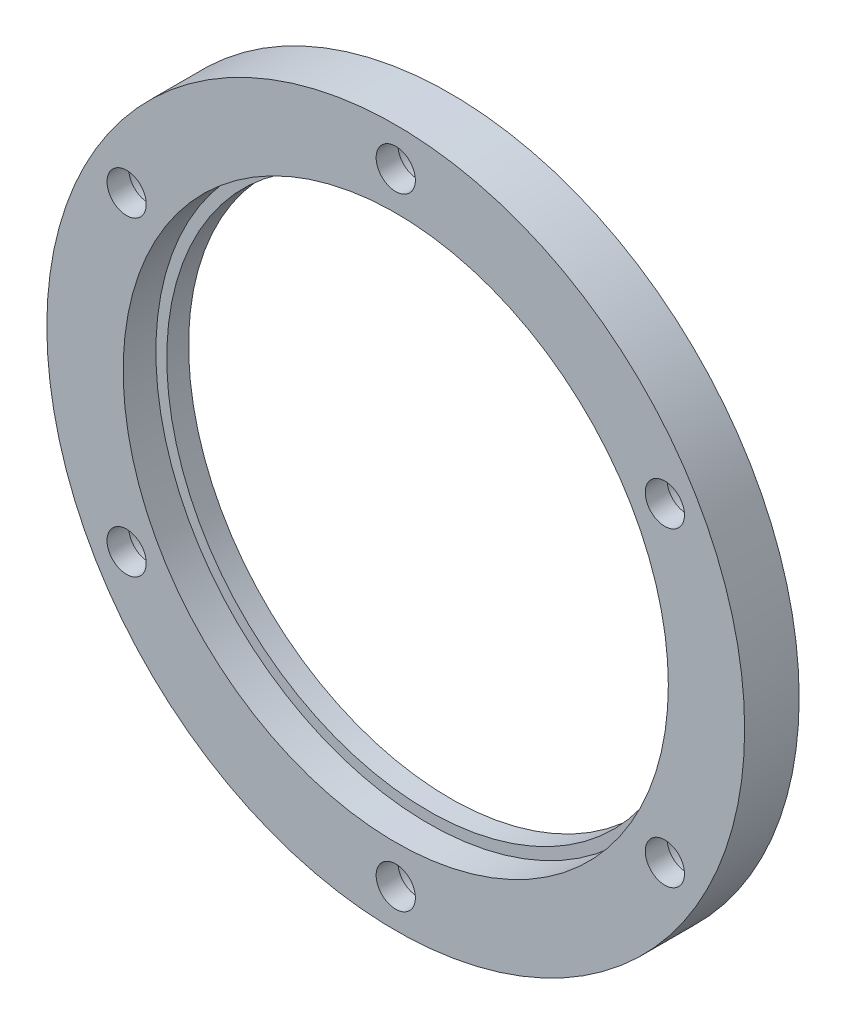
ISO-10303-21;
HEADER;
FILE_DESCRIPTION(('STEP AP214'),'2;1');
FILE_NAME('part.step','',(''),(''),'','','');
FILE_SCHEMA(('AUTOMOTIVE_DESIGN { 1 0 10303 214 1 1 1 1 }'));
ENDSEC;
DATA;
#1=APPLICATION_CONTEXT('core data for automotive mechanical design processes');
#2=APPLICATION_PROTOCOL_DEFINITION('international standard','automotive_design',2000,#1);
#3=PRODUCT_CONTEXT('',#1,'mechanical');
#4=PRODUCT('Part','Part','',(#3));
#5=PRODUCT_RELATED_PRODUCT_CATEGORY('part','',(#4));
#6=PRODUCT_DEFINITION_FORMATION('','',#4);
#7=PRODUCT_DEFINITION_CONTEXT('part definition',#1,'design');
#8=PRODUCT_DEFINITION('design','',#6,#7);
#9=PRODUCT_DEFINITION_SHAPE('','',#8);
#10=(LENGTH_UNIT() NAMED_UNIT(*) SI_UNIT(.MILLI.,.METRE.));
#11=(NAMED_UNIT(*) PLANE_ANGLE_UNIT() SI_UNIT($,.RADIAN.));
#12=(NAMED_UNIT(*) SI_UNIT($,.STERADIAN.) SOLID_ANGLE_UNIT());
#13=UNCERTAINTY_MEASURE_WITH_UNIT(LENGTH_MEASURE(1.E-05),#10,'distance_accuracy_value','');
#14=(GEOMETRIC_REPRESENTATION_CONTEXT(3) GLOBAL_UNCERTAINTY_ASSIGNED_CONTEXT((#13)) GLOBAL_UNIT_ASSIGNED_CONTEXT((#10,
#11,#12)) REPRESENTATION_CONTEXT('',''));
#15=CARTESIAN_POINT('',(0.,0.,0.));
#16=DIRECTION('',(0.,0.,1.));
#17=DIRECTION('',(1.,0.,0.));
#18=AXIS2_PLACEMENT_3D('',#15,#16,#17);
#19=CARTESIAN_POINT('',(24.6817240078565,14.25,0.));
#20=DIRECTION('',(0.,0.,1.));
#21=DIRECTION('',(1.,0.,0.));
#22=AXIS2_PLACEMENT_3D('',#19,#20,#21);
#23=CYLINDRICAL_SURFACE('',#22,1.8);
#24=CARTESIAN_POINT('',(24.6817240078565,14.25,3.));
#25=DIRECTION('',(0.,0.,-1.));
#26=DIRECTION('',(-1.,0.,0.));
#27=AXIS2_PLACEMENT_3D('',#24,#25,#26);
#28=CIRCLE('',#27,1.8);
#29=CARTESIAN_POINT('',(22.8817240078565,14.25,3.));
#30=VERTEX_POINT('',#29);
#31=EDGE_CURVE('E50',#30,#30,#28,.F.);
#32=ORIENTED_EDGE('',*,*,#31,.F.);
#33=EDGE_LOOP('',(#32));
#34=FACE_BOUND('',#33,.T.);
#35=CARTESIAN_POINT('',(24.6817240078566,14.2499999999999,5.));
#36=DIRECTION('',(0.,0.,1.));
#37=DIRECTION('',(1.,0.,0.));
#38=AXIS2_PLACEMENT_3D('',#35,#36,#37);
#39=CIRCLE('',#38,1.8);
#40=CARTESIAN_POINT('',(26.4817240078566,14.2499999999999,5.));
#41=VERTEX_POINT('',#40);
#42=EDGE_CURVE('E158',#41,#41,#39,.T.);
#43=ORIENTED_EDGE('',*,*,#42,.T.);
#44=EDGE_LOOP('',(#43));
#45=FACE_BOUND('',#44,.T.);
#46=ADVANCED_FACE('F43',(#34,#45),#23,.F.);
#47=CARTESIAN_POINT('',(24.6817240078565,-14.25,0.));
#48=DIRECTION('',(0.,0.,1.));
#49=DIRECTION('',(1.,0.,0.));
#50=AXIS2_PLACEMENT_3D('',#47,#48,#49);
#51=CYLINDRICAL_SURFACE('',#50,1.8);
#52=CARTESIAN_POINT('',(24.6817240078565,-14.25,3.));
#53=DIRECTION('',(0.,0.,-1.));
#54=DIRECTION('',(-1.,0.,0.));
#55=AXIS2_PLACEMENT_3D('',#52,#53,#54);
#56=CIRCLE('',#55,1.8);
#57=CARTESIAN_POINT('',(22.8817240078565,-14.25,3.));
#58=VERTEX_POINT('',#57);
#59=EDGE_CURVE('E76',#58,#58,#56,.F.);
#60=ORIENTED_EDGE('',*,*,#59,.F.);
#61=EDGE_LOOP('',(#60));
#62=FACE_BOUND('',#61,.T.);
#63=CARTESIAN_POINT('',(24.6817240078564,-14.2500000000002,5.));
#64=DIRECTION('',(0.,0.,1.));
#65=DIRECTION('',(1.,0.,0.));
#66=AXIS2_PLACEMENT_3D('',#63,#64,#65);
#67=CIRCLE('',#66,1.8);
#68=CARTESIAN_POINT('',(26.4817240078564,-14.2500000000002,5.));
#69=VERTEX_POINT('',#68);
#70=EDGE_CURVE('E161',#69,#69,#67,.T.);
#71=ORIENTED_EDGE('',*,*,#70,.T.);
#72=EDGE_LOOP('',(#71));
#73=FACE_BOUND('',#72,.T.);
#74=ADVANCED_FACE('F212',(#62,#73),#51,.F.);
#75=CARTESIAN_POINT('',(0.,-28.5,0.));
#76=DIRECTION('',(0.,0.,1.));
#77=DIRECTION('',(1.,0.,0.));
#78=AXIS2_PLACEMENT_3D('',#75,#76,#77);
#79=CYLINDRICAL_SURFACE('',#78,1.8);
#80=CARTESIAN_POINT('',(0.,-28.5,3.));
#81=DIRECTION('',(0.,0.,-1.));
#82=DIRECTION('',(-1.,0.,0.));
#83=AXIS2_PLACEMENT_3D('',#80,#81,#82);
#84=CIRCLE('',#83,1.8);
#85=CARTESIAN_POINT('',(-1.8,-28.5,3.));
#86=VERTEX_POINT('',#85);
#87=EDGE_CURVE('E74',#86,#86,#84,.F.);
#88=ORIENTED_EDGE('',*,*,#87,.F.);
#89=EDGE_LOOP('',(#88));
#90=FACE_BOUND('',#89,.T.);
#91=CARTESIAN_POINT('',(-2.70616862252382E-13,-28.5,5.));
#92=DIRECTION('',(0.,0.,1.));
#93=DIRECTION('',(1.,0.,0.));
#94=AXIS2_PLACEMENT_3D('',#91,#92,#93);
#95=CIRCLE('',#94,1.8);
#96=CARTESIAN_POINT('',(1.79999999999973,-28.5,5.));
#97=VERTEX_POINT('',#96);
#98=EDGE_CURVE('E170',#97,#97,#95,.T.);
#99=ORIENTED_EDGE('',*,*,#98,.T.);
#100=EDGE_LOOP('',(#99));
#101=FACE_BOUND('',#100,.T.);
#102=ADVANCED_FACE('F219',(#90,#101),#79,.F.);
#103=CARTESIAN_POINT('',(-24.6817240078565,-14.25,0.));
#104=DIRECTION('',(0.,0.,1.));
#105=DIRECTION('',(1.,0.,0.));
#106=AXIS2_PLACEMENT_3D('',#103,#104,#105);
#107=CYLINDRICAL_SURFACE('',#106,1.8);
#108=CARTESIAN_POINT('',(-24.6817240078565,-14.25,3.));
#109=DIRECTION('',(0.,0.,-1.));
#110=DIRECTION('',(-1.,0.,0.));
#111=AXIS2_PLACEMENT_3D('',#108,#109,#110);
#112=CIRCLE('',#111,1.8);
#113=CARTESIAN_POINT('',(-26.4817240078565,-14.25,3.));
#114=VERTEX_POINT('',#113);
#115=EDGE_CURVE('E71',#114,#114,#112,.F.);
#116=ORIENTED_EDGE('',*,*,#115,.F.);
#117=EDGE_LOOP('',(#116));
#118=FACE_BOUND('',#117,.T.);
#119=CARTESIAN_POINT('',(-24.6817240078567,-14.2499999999997,5.));
#120=DIRECTION('',(0.,0.,1.));
#121=DIRECTION('',(1.,0.,0.));
#122=AXIS2_PLACEMENT_3D('',#119,#120,#121);
#123=CIRCLE('',#122,1.8);
#124=CARTESIAN_POINT('',(-22.8817240078567,-14.2499999999997,5.));
#125=VERTEX_POINT('',#124);
#126=EDGE_CURVE('E171',#125,#125,#123,.T.);
#127=ORIENTED_EDGE('',*,*,#126,.T.);
#128=EDGE_LOOP('',(#127));
#129=FACE_BOUND('',#128,.T.);
#130=ADVANCED_FACE('F176',(#118,#129),#107,.F.);
#131=CARTESIAN_POINT('',(-24.6817240078565,14.25,0.));
#132=DIRECTION('',(0.,0.,1.));
#133=DIRECTION('',(1.,0.,0.));
#134=AXIS2_PLACEMENT_3D('',#131,#132,#133);
#135=CYLINDRICAL_SURFACE('',#134,1.8);
#136=CARTESIAN_POINT('',(-24.6817240078565,14.25,3.));
#137=DIRECTION('',(0.,0.,-1.));
#138=DIRECTION('',(-1.,0.,0.));
#139=AXIS2_PLACEMENT_3D('',#136,#137,#138);
#140=CIRCLE('',#139,1.8);
#141=CARTESIAN_POINT('',(-26.4817240078565,14.25,3.));
#142=VERTEX_POINT('',#141);
#143=EDGE_CURVE('E66',#142,#142,#140,.F.);
#144=ORIENTED_EDGE('',*,*,#143,.F.);
#145=EDGE_LOOP('',(#144));
#146=FACE_BOUND('',#145,.T.);
#147=CARTESIAN_POINT('',(-24.6817240078565,14.25,5.));
#148=DIRECTION('',(0.,0.,1.));
#149=DIRECTION('',(1.,0.,0.));
#150=AXIS2_PLACEMENT_3D('',#147,#148,#149);
#151=CIRCLE('',#150,1.8);
#152=CARTESIAN_POINT('',(-22.8817240078565,14.25,5.));
#153=VERTEX_POINT('',#152);
#154=EDGE_CURVE('E151',#153,#153,#151,.T.);
#155=ORIENTED_EDGE('',*,*,#154,.T.);
#156=EDGE_LOOP('',(#155));
#157=FACE_BOUND('',#156,.T.);
#158=ADVANCED_FACE('F210',(#146,#157),#135,.F.);
#159=CARTESIAN_POINT('',(0.,28.5,0.));
#160=DIRECTION('',(0.,0.,1.));
#161=DIRECTION('',(1.,0.,0.));
#162=AXIS2_PLACEMENT_3D('',#159,#160,#161);
#163=CYLINDRICAL_SURFACE('',#162,1.8);
#164=CARTESIAN_POINT('',(0.,28.5,3.));
#165=DIRECTION('',(0.,0.,-1.));
#166=DIRECTION('',(-1.,0.,0.));
#167=AXIS2_PLACEMENT_3D('',#164,#165,#166);
#168=CIRCLE('',#167,1.8);
#169=CARTESIAN_POINT('',(-1.8,28.5,3.));
#170=VERTEX_POINT('',#169);
#171=EDGE_CURVE('E65',#170,#170,#168,.F.);
#172=ORIENTED_EDGE('',*,*,#171,.F.);
#173=EDGE_LOOP('',(#172));
#174=FACE_BOUND('',#173,.T.);
#175=CARTESIAN_POINT('',(0.,28.5,5.));
#176=DIRECTION('',(0.,0.,1.));
#177=DIRECTION('',(1.,0.,0.));
#178=AXIS2_PLACEMENT_3D('',#175,#176,#177);
#179=CIRCLE('',#178,1.8);
#180=CARTESIAN_POINT('',(1.80000000000007,28.5,5.));
#181=VERTEX_POINT('',#180);
#182=EDGE_CURVE('E155',#181,#181,#179,.T.);
#183=ORIENTED_EDGE('',*,*,#182,.T.);
#184=EDGE_LOOP('',(#183));
#185=FACE_BOUND('',#184,.T.);
#186=ADVANCED_FACE('F198',(#174,#185),#163,.F.);
#187=CARTESIAN_POINT('',(0.,0.,2.));
#188=DIRECTION('',(0.,0.,-1.));
#189=DIRECTION('',(-1.,0.,0.));
#190=AXIS2_PLACEMENT_3D('',#187,#188,#189);
#191=CYLINDRICAL_SURFACE('',#190,32.);
#192=CARTESIAN_POINT('',(0.,0.,0.));
#193=DIRECTION('',(0.,0.,1.));
#194=DIRECTION('',(1.,0.,0.));
#195=AXIS2_PLACEMENT_3D('',#192,#193,#194);
#196=CIRCLE('',#195,32.);
#197=CARTESIAN_POINT('',(32.,0.,0.));
#198=VERTEX_POINT('',#197);
#199=EDGE_CURVE('E10',#198,#198,#196,.T.);
#200=ORIENTED_EDGE('',*,*,#199,.T.);
#201=EDGE_LOOP('',(#200));
#202=FACE_BOUND('',#201,.T.);
#203=CARTESIAN_POINT('',(0.,0.,5.));
#204=DIRECTION('',(0.,0.,1.));
#205=DIRECTION('',(1.,0.,0.));
#206=AXIS2_PLACEMENT_3D('',#203,#204,#205);
#207=CIRCLE('',#206,32.);
#208=CARTESIAN_POINT('',(32.,0.,5.));
#209=VERTEX_POINT('',#208);
#210=EDGE_CURVE('E107',#209,#209,#207,.T.);
#211=ORIENTED_EDGE('',*,*,#210,.F.);
#212=EDGE_LOOP('',(#211));
#213=FACE_BOUND('',#212,.T.);
#214=ADVANCED_FACE('F44',(#202,#213),#191,.T.);
#215=CARTESIAN_POINT('',(0.,0.,6.));
#216=DIRECTION('',(0.,0.,-1.));
#217=DIRECTION('',(-1.,0.,0.));
#218=AXIS2_PLACEMENT_3D('',#215,#216,#217);
#219=CYLINDRICAL_SURFACE('',#218,25.);
#220=CARTESIAN_POINT('',(0.,0.,2.));
#221=DIRECTION('',(0.,0.,1.));
#222=DIRECTION('',(1.,0.,0.));
#223=AXIS2_PLACEMENT_3D('',#220,#221,#222);
#224=CIRCLE('',#223,25.);
#225=CARTESIAN_POINT('',(25.,0.,2.));
#226=VERTEX_POINT('',#225);
#227=EDGE_CURVE('E83',#226,#226,#224,.T.);
#228=ORIENTED_EDGE('',*,*,#227,.F.);
#229=EDGE_LOOP('',(#228));
#230=FACE_BOUND('',#229,.T.);
#231=CARTESIAN_POINT('',(0.,0.,5.));
#232=DIRECTION('',(0.,0.,1.));
#233=DIRECTION('',(1.,0.,0.));
#234=AXIS2_PLACEMENT_3D('',#231,#232,#233);
#235=CIRCLE('',#234,25.);
#236=CARTESIAN_POINT('',(25.,0.,5.));
#237=VERTEX_POINT('',#236);
#238=EDGE_CURVE('E150',#237,#237,#235,.T.);
#239=ORIENTED_EDGE('',*,*,#238,.T.);
#240=EDGE_LOOP('',(#239));
#241=FACE_BOUND('',#240,.T.);
#242=ADVANCED_FACE('F199',(#230,#241),#219,.F.);
#243=CARTESIAN_POINT('',(0.,0.,2.));
#244=DIRECTION('',(0.,0.,1.));
#245=DIRECTION('',(1.,0.,0.));
#246=AXIS2_PLACEMENT_3D('',#243,#244,#245);
#247=PLANE('',#246);
#248=CARTESIAN_POINT('',(0.,0.,2.));
#249=DIRECTION('',(0.,0.,1.));
#250=DIRECTION('',(1.,0.,0.));
#251=AXIS2_PLACEMENT_3D('',#248,#249,#250);
#252=CIRCLE('',#251,24.);
#253=CARTESIAN_POINT('',(24.,0.,2.));
#254=VERTEX_POINT('',#253);
#255=EDGE_CURVE('E55',#254,#254,#252,.T.);
#256=ORIENTED_EDGE('',*,*,#255,.F.);
#257=EDGE_LOOP('',(#256));
#258=FACE_BOUND('',#257,.T.);
#259=ORIENTED_EDGE('',*,*,#227,.T.);
#260=EDGE_LOOP('',(#259));
#261=FACE_BOUND('',#260,.T.);
#262=ADVANCED_FACE('F203',(#258,#261),#247,.T.);
#263=CARTESIAN_POINT('',(0.,0.,0.));
#264=DIRECTION('',(0.,0.,1.));
#265=DIRECTION('',(1.,0.,0.));
#266=AXIS2_PLACEMENT_3D('',#263,#264,#265);
#267=PLANE('',#266);
#268=CARTESIAN_POINT('',(-9.65461323865484E-12,-28.5000000000048,0.));
#269=DIRECTION('',(0.,0.,-1.));
#270=DIRECTION('',(-1.,0.,0.));
#271=AXIS2_PLACEMENT_3D('',#268,#269,#270);
#272=CIRCLE('',#271,2.84999999999692);
#273=CARTESIAN_POINT('',(-2.85000000000658,-28.5000000000048,0.));
#274=VERTEX_POINT('',#273);
#275=EDGE_CURVE('E108',#274,#274,#272,.T.);
#276=ORIENTED_EDGE('',*,*,#275,.F.);
#277=EDGE_LOOP('',(#276));
#278=FACE_BOUND('',#277,.T.);
#279=CARTESIAN_POINT('',(-24.6817240078735,-14.2500000000043,0.));
#280=DIRECTION('',(0.,0.,-1.));
#281=DIRECTION('',(-1.,0.,0.));
#282=AXIS2_PLACEMENT_3D('',#279,#280,#281);
#283=CIRCLE('',#282,2.85000000000252);
#284=CARTESIAN_POINT('',(-27.531724007876,-14.2500000000043,0.));
#285=VERTEX_POINT('',#284);
#286=EDGE_CURVE('E120',#285,#285,#283,.T.);
#287=ORIENTED_EDGE('',*,*,#286,.F.);
#288=EDGE_LOOP('',(#287));
#289=FACE_BOUND('',#288,.T.);
#290=CARTESIAN_POINT('',(-24.6817240078767,14.2500000000023,0.));
#291=DIRECTION('',(0.,0.,-1.));
#292=DIRECTION('',(-1.,0.,0.));
#293=AXIS2_PLACEMENT_3D('',#290,#291,#292);
#294=CIRCLE('',#293,2.85000000000562);
#295=CARTESIAN_POINT('',(-27.5317240078823,14.2500000000023,0.));
#296=VERTEX_POINT('',#295);
#297=EDGE_CURVE('E123',#296,#296,#294,.T.);
#298=ORIENTED_EDGE('',*,*,#297,.F.);
#299=EDGE_LOOP('',(#298));
#300=FACE_BOUND('',#299,.T.);
#301=CARTESIAN_POINT('',(-1.60198822870689E-11,28.5000000000084,0.));
#302=DIRECTION('',(0.,0.,-1.));
#303=DIRECTION('',(-1.,0.,0.));
#304=AXIS2_PLACEMENT_3D('',#301,#302,#303);
#305=CIRCLE('',#304,2.85000000000311);
#306=CARTESIAN_POINT('',(-2.85000000001913,28.5000000000084,0.));
#307=VERTEX_POINT('',#306);
#308=EDGE_CURVE('E134',#307,#307,#305,.T.);
#309=ORIENTED_EDGE('',*,*,#308,.F.);
#310=EDGE_LOOP('',(#309));
#311=FACE_BOUND('',#310,.T.);
#312=CARTESIAN_POINT('',(24.6817240078478,14.2500000000078,0.));
#313=DIRECTION('',(0.,0.,-1.));
#314=DIRECTION('',(-1.,0.,0.));
#315=AXIS2_PLACEMENT_3D('',#312,#313,#314);
#316=CIRCLE('',#315,2.84999999999439);
#317=CARTESIAN_POINT('',(21.8317240078534,14.2500000000078,0.));
#318=VERTEX_POINT('',#317);
#319=EDGE_CURVE('E99',#318,#318,#316,.T.);
#320=ORIENTED_EDGE('',*,*,#319,.F.);
#321=EDGE_LOOP('',(#320));
#322=FACE_BOUND('',#321,.T.);
#323=CARTESIAN_POINT('',(24.681724007851,-14.2499999999988,0.));
#324=DIRECTION('',(0.,0.,-1.));
#325=DIRECTION('',(-1.,0.,0.));
#326=AXIS2_PLACEMENT_3D('',#323,#324,#325);
#327=CIRCLE('',#326,2.84999999999439);
#328=CARTESIAN_POINT('',(21.8317240078566,-14.2499999999988,0.));
#329=VERTEX_POINT('',#328);
#330=EDGE_CURVE('E98',#329,#329,#327,.T.);
#331=ORIENTED_EDGE('',*,*,#330,.F.);
#332=EDGE_LOOP('',(#331));
#333=FACE_BOUND('',#332,.T.);
#334=ORIENTED_EDGE('',*,*,#199,.F.);
#335=EDGE_LOOP('',(#334));
#336=FACE_BOUND('',#335,.T.);
#337=CARTESIAN_POINT('',(0.,0.,0.));
#338=DIRECTION('',(0.,0.,1.));
#339=DIRECTION('',(1.,0.,0.));
#340=AXIS2_PLACEMENT_3D('',#337,#338,#339);
#341=CIRCLE('',#340,24.);
#342=CARTESIAN_POINT('',(24.,0.,0.));
#343=VERTEX_POINT('',#342);
#344=EDGE_CURVE('E59',#343,#343,#341,.T.);
#345=ORIENTED_EDGE('',*,*,#344,.T.);
#346=EDGE_LOOP('',(#345));
#347=FACE_BOUND('',#346,.T.);
#348=ADVANCED_FACE('F234',(#278,#289,#300,#311,#322,#333,#336,#347),#267,.F.);
#349=CARTESIAN_POINT('',(0.,0.,2.));
#350=DIRECTION('',(0.,0.,-1.));
#351=DIRECTION('',(-1.,0.,0.));
#352=AXIS2_PLACEMENT_3D('',#349,#350,#351);
#353=CYLINDRICAL_SURFACE('',#352,24.);
#354=ORIENTED_EDGE('',*,*,#255,.T.);
#355=EDGE_LOOP('',(#354));
#356=FACE_BOUND('',#355,.T.);
#357=ORIENTED_EDGE('',*,*,#344,.F.);
#358=EDGE_LOOP('',(#357));
#359=FACE_BOUND('',#358,.T.);
#360=ADVANCED_FACE('F229',(#356,#359),#353,.F.);
#361=CARTESIAN_POINT('',(-1.60198822870689E-11,28.5000000000084,3.));
#362=DIRECTION('',(0.,0.,-1.));
#363=DIRECTION('',(-1.,0.,0.));
#364=AXIS2_PLACEMENT_3D('',#361,#362,#363);
#365=PLANE('',#364);
#366=CARTESIAN_POINT('',(-1.60198822870689E-11,28.5000000000084,3.));
#367=DIRECTION('',(0.,0.,-1.));
#368=DIRECTION('',(-1.,0.,0.));
#369=AXIS2_PLACEMENT_3D('',#366,#367,#368);
#370=CIRCLE('',#369,2.85000000000311);
#371=CARTESIAN_POINT('',(-2.85000000001913,28.5000000000084,3.));
#372=VERTEX_POINT('',#371);
#373=EDGE_CURVE('E126',#372,#372,#370,.T.);
#374=ORIENTED_EDGE('',*,*,#373,.T.);
#375=EDGE_LOOP('',(#374));
#376=FACE_BOUND('',#375,.T.);
#377=ORIENTED_EDGE('',*,*,#171,.T.);
#378=EDGE_LOOP('',(#377));
#379=FACE_BOUND('',#378,.T.);
#380=ADVANCED_FACE('F231',(#376,#379),#365,.T.);
#381=CARTESIAN_POINT('',(-1.60198822870689E-11,28.5000000000084,3.));
#382=DIRECTION('',(0.,0.,-1.));
#383=DIRECTION('',(-1.,0.,0.));
#384=AXIS2_PLACEMENT_3D('',#381,#382,#383);
#385=CYLINDRICAL_SURFACE('',#384,2.85000000000311);
#386=ORIENTED_EDGE('',*,*,#373,.F.);
#387=EDGE_LOOP('',(#386));
#388=FACE_BOUND('',#387,.T.);
#389=ORIENTED_EDGE('',*,*,#308,.T.);
#390=EDGE_LOOP('',(#389));
#391=FACE_BOUND('',#390,.T.);
#392=ADVANCED_FACE('F294',(#388,#391),#385,.F.);
#393=CARTESIAN_POINT('',(-24.6817240078767,14.2500000000023,3.));
#394=DIRECTION('',(0.,0.,-1.));
#395=DIRECTION('',(-1.,0.,0.));
#396=AXIS2_PLACEMENT_3D('',#393,#394,#395);
#397=PLANE('',#396);
#398=CARTESIAN_POINT('',(-24.6817240078767,14.2500000000023,3.));
#399=DIRECTION('',(0.,0.,-1.));
#400=DIRECTION('',(-1.,0.,0.));
#401=AXIS2_PLACEMENT_3D('',#398,#399,#400);
#402=CIRCLE('',#401,2.85000000000562);
#403=CARTESIAN_POINT('',(-27.5317240078823,14.2500000000023,3.));
#404=VERTEX_POINT('',#403);
#405=EDGE_CURVE('E122',#404,#404,#402,.T.);
#406=ORIENTED_EDGE('',*,*,#405,.T.);
#407=EDGE_LOOP('',(#406));
#408=FACE_BOUND('',#407,.T.);
#409=ORIENTED_EDGE('',*,*,#143,.T.);
#410=EDGE_LOOP('',(#409));
#411=FACE_BOUND('',#410,.T.);
#412=ADVANCED_FACE('F292',(#408,#411),#397,.T.);
#413=CARTESIAN_POINT('',(-24.6817240078767,14.2500000000023,3.));
#414=DIRECTION('',(0.,0.,-1.));
#415=DIRECTION('',(-1.,0.,0.));
#416=AXIS2_PLACEMENT_3D('',#413,#414,#415);
#417=CYLINDRICAL_SURFACE('',#416,2.85000000000562);
#418=ORIENTED_EDGE('',*,*,#405,.F.);
#419=EDGE_LOOP('',(#418));
#420=FACE_BOUND('',#419,.T.);
#421=ORIENTED_EDGE('',*,*,#297,.T.);
#422=EDGE_LOOP('',(#421));
#423=FACE_BOUND('',#422,.T.);
#424=ADVANCED_FACE('F290',(#420,#423),#417,.F.);
#425=CARTESIAN_POINT('',(-24.6817240078735,-14.2500000000043,3.));
#426=DIRECTION('',(0.,0.,-1.));
#427=DIRECTION('',(-1.,0.,0.));
#428=AXIS2_PLACEMENT_3D('',#425,#426,#427);
#429=PLANE('',#428);
#430=CARTESIAN_POINT('',(-24.6817240078735,-14.2500000000043,3.));
#431=DIRECTION('',(0.,0.,-1.));
#432=DIRECTION('',(-1.,0.,0.));
#433=AXIS2_PLACEMENT_3D('',#430,#431,#432);
#434=CIRCLE('',#433,2.85000000000252);
#435=CARTESIAN_POINT('',(-27.531724007876,-14.2500000000043,3.));
#436=VERTEX_POINT('',#435);
#437=EDGE_CURVE('E113',#436,#436,#434,.T.);
#438=ORIENTED_EDGE('',*,*,#437,.T.);
#439=EDGE_LOOP('',(#438));
#440=FACE_BOUND('',#439,.T.);
#441=ORIENTED_EDGE('',*,*,#115,.T.);
#442=EDGE_LOOP('',(#441));
#443=FACE_BOUND('',#442,.T.);
#444=ADVANCED_FACE('F283',(#440,#443),#429,.T.);
#445=CARTESIAN_POINT('',(-24.6817240078735,-14.2500000000043,3.));
#446=DIRECTION('',(0.,0.,-1.));
#447=DIRECTION('',(-1.,0.,0.));
#448=AXIS2_PLACEMENT_3D('',#445,#446,#447);
#449=CYLINDRICAL_SURFACE('',#448,2.85000000000252);
#450=ORIENTED_EDGE('',*,*,#437,.F.);
#451=EDGE_LOOP('',(#450));
#452=FACE_BOUND('',#451,.T.);
#453=ORIENTED_EDGE('',*,*,#286,.T.);
#454=EDGE_LOOP('',(#453));
#455=FACE_BOUND('',#454,.T.);
#456=ADVANCED_FACE('F276',(#452,#455),#449,.F.);
#457=CARTESIAN_POINT('',(-9.65461323865484E-12,-28.5000000000048,3.));
#458=DIRECTION('',(0.,0.,-1.));
#459=DIRECTION('',(-1.,0.,0.));
#460=AXIS2_PLACEMENT_3D('',#457,#458,#459);
#461=PLANE('',#460);
#462=CARTESIAN_POINT('',(-9.65461323865484E-12,-28.5000000000048,3.));
#463=DIRECTION('',(0.,0.,-1.));
#464=DIRECTION('',(-1.,0.,0.));
#465=AXIS2_PLACEMENT_3D('',#462,#463,#464);
#466=CIRCLE('',#465,2.84999999999692);
#467=CARTESIAN_POINT('',(-2.85000000000658,-28.5000000000048,3.));
#468=VERTEX_POINT('',#467);
#469=EDGE_CURVE('E104',#468,#468,#466,.T.);
#470=ORIENTED_EDGE('',*,*,#469,.T.);
#471=EDGE_LOOP('',(#470));
#472=FACE_BOUND('',#471,.T.);
#473=ORIENTED_EDGE('',*,*,#87,.T.);
#474=EDGE_LOOP('',(#473));
#475=FACE_BOUND('',#474,.T.);
#476=ADVANCED_FACE('F277',(#472,#475),#461,.T.);
#477=CARTESIAN_POINT('',(-9.65461323865484E-12,-28.5000000000048,3.));
#478=DIRECTION('',(0.,0.,-1.));
#479=DIRECTION('',(-1.,0.,0.));
#480=AXIS2_PLACEMENT_3D('',#477,#478,#479);
#481=CYLINDRICAL_SURFACE('',#480,2.84999999999692);
#482=ORIENTED_EDGE('',*,*,#469,.F.);
#483=EDGE_LOOP('',(#482));
#484=FACE_BOUND('',#483,.T.);
#485=ORIENTED_EDGE('',*,*,#275,.T.);
#486=EDGE_LOOP('',(#485));
#487=FACE_BOUND('',#486,.T.);
#488=ADVANCED_FACE('F272',(#484,#487),#481,.F.);
#489=CARTESIAN_POINT('',(24.681724007851,-14.2499999999988,3.));
#490=DIRECTION('',(0.,0.,-1.));
#491=DIRECTION('',(-1.,0.,0.));
#492=AXIS2_PLACEMENT_3D('',#489,#490,#491);
#493=PLANE('',#492);
#494=CARTESIAN_POINT('',(24.681724007851,-14.2499999999988,3.));
#495=DIRECTION('',(0.,0.,-1.));
#496=DIRECTION('',(-1.,0.,0.));
#497=AXIS2_PLACEMENT_3D('',#494,#495,#496);
#498=CIRCLE('',#497,2.84999999999439);
#499=CARTESIAN_POINT('',(21.8317240078566,-14.2499999999988,3.));
#500=VERTEX_POINT('',#499);
#501=EDGE_CURVE('E67',#500,#500,#498,.T.);
#502=ORIENTED_EDGE('',*,*,#501,.T.);
#503=EDGE_LOOP('',(#502));
#504=FACE_BOUND('',#503,.T.);
#505=ORIENTED_EDGE('',*,*,#59,.T.);
#506=EDGE_LOOP('',(#505));
#507=FACE_BOUND('',#506,.T.);
#508=ADVANCED_FACE('F262',(#504,#507),#493,.T.);
#509=CARTESIAN_POINT('',(24.681724007851,-14.2499999999988,3.));
#510=DIRECTION('',(0.,0.,-1.));
#511=DIRECTION('',(-1.,0.,0.));
#512=AXIS2_PLACEMENT_3D('',#509,#510,#511);
#513=CYLINDRICAL_SURFACE('',#512,2.84999999999439);
#514=ORIENTED_EDGE('',*,*,#501,.F.);
#515=EDGE_LOOP('',(#514));
#516=FACE_BOUND('',#515,.T.);
#517=ORIENTED_EDGE('',*,*,#330,.T.);
#518=EDGE_LOOP('',(#517));
#519=FACE_BOUND('',#518,.T.);
#520=ADVANCED_FACE('F256',(#516,#519),#513,.F.);
#521=CARTESIAN_POINT('',(24.6817240078478,14.2500000000078,3.));
#522=DIRECTION('',(0.,0.,-1.));
#523=DIRECTION('',(-1.,0.,0.));
#524=AXIS2_PLACEMENT_3D('',#521,#522,#523);
#525=PLANE('',#524);
#526=CARTESIAN_POINT('',(24.6817240078478,14.2500000000078,3.));
#527=DIRECTION('',(0.,0.,-1.));
#528=DIRECTION('',(-1.,0.,0.));
#529=AXIS2_PLACEMENT_3D('',#526,#527,#528);
#530=CIRCLE('',#529,2.84999999999439);
#531=CARTESIAN_POINT('',(21.8317240078534,14.2500000000078,3.));
#532=VERTEX_POINT('',#531);
#533=EDGE_CURVE('E140',#532,#532,#530,.T.);
#534=ORIENTED_EDGE('',*,*,#533,.T.);
#535=EDGE_LOOP('',(#534));
#536=FACE_BOUND('',#535,.T.);
#537=ORIENTED_EDGE('',*,*,#31,.T.);
#538=EDGE_LOOP('',(#537));
#539=FACE_BOUND('',#538,.T.);
#540=ADVANCED_FACE('F261',(#536,#539),#525,.T.);
#541=CARTESIAN_POINT('',(24.6817240078478,14.2500000000078,3.));
#542=DIRECTION('',(0.,0.,-1.));
#543=DIRECTION('',(-1.,0.,0.));
#544=AXIS2_PLACEMENT_3D('',#541,#542,#543);
#545=CYLINDRICAL_SURFACE('',#544,2.84999999999439);
#546=ORIENTED_EDGE('',*,*,#533,.F.);
#547=EDGE_LOOP('',(#546));
#548=FACE_BOUND('',#547,.T.);
#549=ORIENTED_EDGE('',*,*,#319,.T.);
#550=EDGE_LOOP('',(#549));
#551=FACE_BOUND('',#550,.T.);
#552=ADVANCED_FACE('F181',(#548,#551),#545,.F.);
#553=CARTESIAN_POINT('',(0.,0.,5.));
#554=DIRECTION('',(0.,0.,1.));
#555=DIRECTION('',(1.,0.,0.));
#556=AXIS2_PLACEMENT_3D('',#553,#554,#555);
#557=PLANE('',#556);
#558=ORIENTED_EDGE('',*,*,#126,.F.);
#559=EDGE_LOOP('',(#558));
#560=FACE_BOUND('',#559,.T.);
#561=ORIENTED_EDGE('',*,*,#98,.F.);
#562=EDGE_LOOP('',(#561));
#563=FACE_BOUND('',#562,.T.);
#564=ORIENTED_EDGE('',*,*,#70,.F.);
#565=EDGE_LOOP('',(#564));
#566=FACE_BOUND('',#565,.T.);
#567=ORIENTED_EDGE('',*,*,#42,.F.);
#568=EDGE_LOOP('',(#567));
#569=FACE_BOUND('',#568,.T.);
#570=ORIENTED_EDGE('',*,*,#182,.F.);
#571=EDGE_LOOP('',(#570));
#572=FACE_BOUND('',#571,.T.);
#573=ORIENTED_EDGE('',*,*,#154,.F.);
#574=EDGE_LOOP('',(#573));
#575=FACE_BOUND('',#574,.T.);
#576=ORIENTED_EDGE('',*,*,#238,.F.);
#577=EDGE_LOOP('',(#576));
#578=FACE_BOUND('',#577,.T.);
#579=ORIENTED_EDGE('',*,*,#210,.T.);
#580=EDGE_LOOP('',(#579));
#581=FACE_BOUND('',#580,.T.);
#582=ADVANCED_FACE('F178',(#560,#563,#566,#569,#572,#575,#578,#581),#557,.T.);
#583=CLOSED_SHELL('',(#46,#74,#102,#130,#158,#186,#214,#242,#262,#348,#360,#380,#392,#412,#424,
#444,#456,#476,#488,#508,#520,#540,#552,#582));
#584=MANIFOLD_SOLID_BREP('B2',#583);
#585=ADVANCED_BREP_SHAPE_REPRESENTATION('',(#18,#584),#14);
#586=SHAPE_DEFINITION_REPRESENTATION(#9,#585);
ENDSEC;
END-ISO-10303-21;
